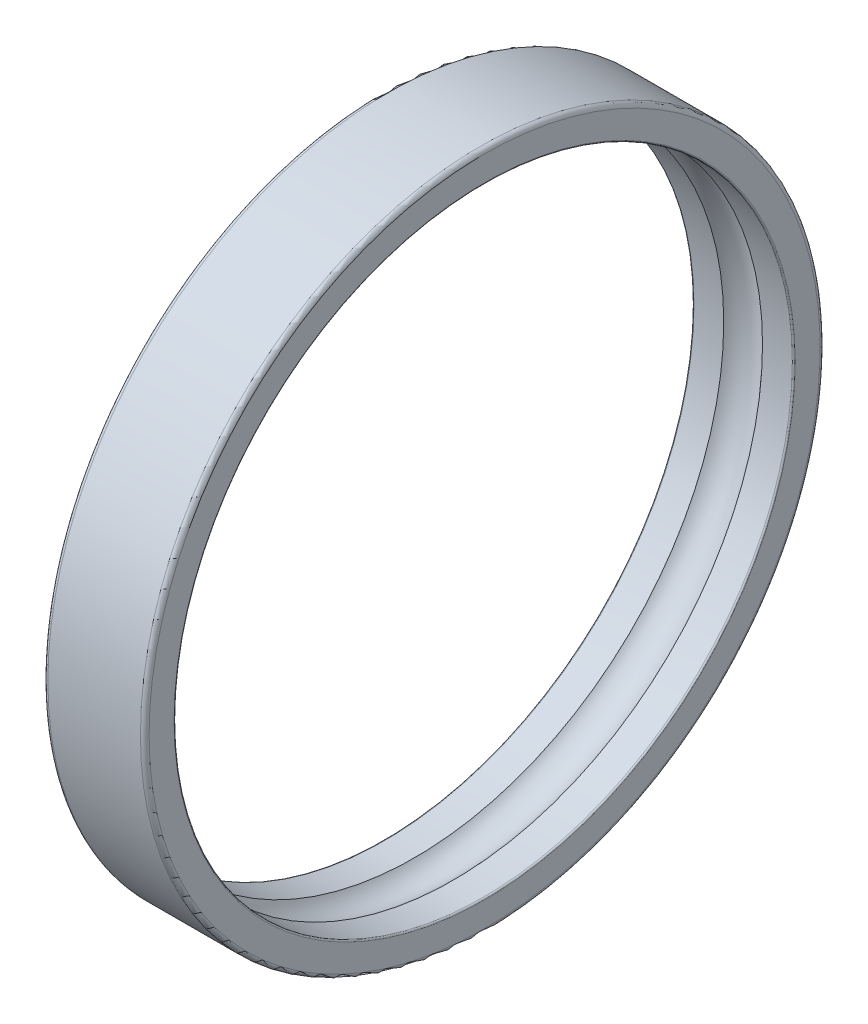
ISO-10303-21;
HEADER;
FILE_DESCRIPTION(('STEP AP214'),'2;1');
FILE_NAME('part.step','',(''),(''),'','','');
FILE_SCHEMA(('AUTOMOTIVE_DESIGN { 1 0 10303 214 1 1 1 1 }'));
ENDSEC;
DATA;
#1=APPLICATION_CONTEXT('core data for automotive mechanical design processes');
#2=APPLICATION_PROTOCOL_DEFINITION('international standard','automotive_design',2000,#1);
#3=PRODUCT_CONTEXT('',#1,'mechanical');
#4=PRODUCT('Part','Part','',(#3));
#5=PRODUCT_RELATED_PRODUCT_CATEGORY('part','',(#4));
#6=PRODUCT_DEFINITION_FORMATION('','',#4);
#7=PRODUCT_DEFINITION_CONTEXT('part definition',#1,'design');
#8=PRODUCT_DEFINITION('design','',#6,#7);
#9=PRODUCT_DEFINITION_SHAPE('','',#8);
#10=(LENGTH_UNIT() NAMED_UNIT(*) SI_UNIT(.MILLI.,.METRE.));
#11=(NAMED_UNIT(*) PLANE_ANGLE_UNIT() SI_UNIT($,.RADIAN.));
#12=(NAMED_UNIT(*) SI_UNIT($,.STERADIAN.) SOLID_ANGLE_UNIT());
#13=UNCERTAINTY_MEASURE_WITH_UNIT(LENGTH_MEASURE(1.E-05),#10,'distance_accuracy_value','');
#14=(GEOMETRIC_REPRESENTATION_CONTEXT(3) GLOBAL_UNCERTAINTY_ASSIGNED_CONTEXT((#13)) GLOBAL_UNIT_ASSIGNED_CONTEXT((#10,
#11,#12)) REPRESENTATION_CONTEXT('',''));
#15=CARTESIAN_POINT('',(0.,0.,0.));
#16=DIRECTION('',(0.,0.,1.));
#17=DIRECTION('',(1.,0.,0.));
#18=AXIS2_PLACEMENT_3D('',#15,#16,#17);
#19=CARTESIAN_POINT('',(0.,-23.6309711748326,-23.2));
#20=DIRECTION('',(-1.,0.,0.));
#21=DIRECTION('',(0.,0.,1.));
#22=AXIS2_PLACEMENT_3D('',#19,#20,#21);
#23=PLANE('',#22);
#24=CARTESIAN_POINT('',(0.,0.,0.));
#25=DIRECTION('',(-1.,0.,0.));
#26=DIRECTION('',(0.,0.,-1.));
#27=AXIS2_PLACEMENT_3D('',#24,#25,#26);
#28=CIRCLE('',#27,23.2);
#29=CARTESIAN_POINT('',(0.,0.,-23.2));
#30=VERTEX_POINT('',#29);
#31=EDGE_CURVE('E50',#30,#30,#28,.F.);
#32=ORIENTED_EDGE('',*,*,#31,.F.);
#33=EDGE_LOOP('',(#32));
#34=FACE_BOUND('',#33,.T.);
#35=CARTESIAN_POINT('',(0.,0.,0.));
#36=DIRECTION('',(1.,0.,0.));
#37=DIRECTION('',(0.,0.,1.));
#38=AXIS2_PLACEMENT_3D('',#35,#36,#37);
#39=CIRCLE('',#38,21.4749999999994);
#40=CARTESIAN_POINT('',(0.,0.,21.4749999999994));
#41=VERTEX_POINT('',#40);
#42=EDGE_CURVE('E47',#41,#41,#39,.T.);
#43=ORIENTED_EDGE('',*,*,#42,.T.);
#44=EDGE_LOOP('',(#43));
#45=FACE_BOUND('',#44,.T.);
#46=ADVANCED_FACE('F15',(#34,#45),#23,.T.);
#47=CARTESIAN_POINT('',(7.,-23.6309711748326,23.2));
#48=DIRECTION('',(1.,0.,0.));
#49=DIRECTION('',(0.,0.,-1.));
#50=AXIS2_PLACEMENT_3D('',#47,#48,#49);
#51=PLANE('',#50);
#52=CARTESIAN_POINT('',(7.,0.,0.));
#53=DIRECTION('',(1.,0.,0.));
#54=DIRECTION('',(0.,0.,1.));
#55=AXIS2_PLACEMENT_3D('',#52,#53,#54);
#56=CIRCLE('',#55,23.2);
#57=CARTESIAN_POINT('',(7.,0.,23.2));
#58=VERTEX_POINT('',#57);
#59=EDGE_CURVE('E44',#58,#58,#56,.T.);
#60=ORIENTED_EDGE('',*,*,#59,.T.);
#61=EDGE_LOOP('',(#60));
#62=FACE_BOUND('',#61,.T.);
#63=CARTESIAN_POINT('',(7.,0.,0.));
#64=DIRECTION('',(-1.,0.,0.));
#65=DIRECTION('',(0.,0.,-1.));
#66=AXIS2_PLACEMENT_3D('',#63,#64,#65);
#67=CIRCLE('',#66,21.475);
#68=CARTESIAN_POINT('',(7.,0.,-21.475));
#69=VERTEX_POINT('',#68);
#70=EDGE_CURVE('E41',#69,#69,#67,.F.);
#71=ORIENTED_EDGE('',*,*,#70,.F.);
#72=EDGE_LOOP('',(#71));
#73=FACE_BOUND('',#72,.T.);
#74=ADVANCED_FACE('F59',(#62,#73),#51,.T.);
#75=CARTESIAN_POINT('',(0.299999999999941,0.,0.));
#76=DIRECTION('',(1.,0.,0.));
#77=DIRECTION('',(0.,1.92349814194667E-10,1.));
#78=AXIS2_PLACEMENT_3D('',#75,#76,#77);
#79=TOROIDAL_SURFACE('',#78,23.2,0.299999999999939);
#80=ORIENTED_EDGE('',*,*,#31,.T.);
#81=EDGE_LOOP('',(#80));
#82=FACE_BOUND('',#81,.T.);
#83=CARTESIAN_POINT('',(0.299999999999941,0.,0.));
#84=DIRECTION('',(-1.,0.,0.));
#85=DIRECTION('',(0.,0.,-1.));
#86=AXIS2_PLACEMENT_3D('',#83,#84,#85);
#87=CIRCLE('',#86,23.4999999999999);
#88=CARTESIAN_POINT('',(0.299999999999941,0.,-23.4999999999999));
#89=VERTEX_POINT('',#88);
#90=EDGE_CURVE('E38',#89,#89,#87,.F.);
#91=ORIENTED_EDGE('',*,*,#90,.F.);
#92=EDGE_LOOP('',(#91));
#93=FACE_BOUND('',#92,.T.);
#94=ADVANCED_FACE('F54',(#82,#93),#79,.T.);
#95=CARTESIAN_POINT('',(0.0999999999994021,0.,0.));
#96=DIRECTION('',(1.,0.,0.));
#97=DIRECTION('',(0.,0.,1.));
#98=AXIS2_PLACEMENT_3D('',#95,#96,#97);
#99=TOROIDAL_SURFACE('',#98,21.4749999999994,0.0999999999994021);
#100=CARTESIAN_POINT('',(0.100000000000003,0.,0.));
#101=DIRECTION('',(1.,0.,0.));
#102=DIRECTION('',(0.,0.,1.));
#103=AXIS2_PLACEMENT_3D('',#100,#101,#102);
#104=CIRCLE('',#103,21.375);
#105=CARTESIAN_POINT('',(0.100000000000003,0.,21.375));
#106=VERTEX_POINT('',#105);
#107=EDGE_CURVE('E35',#106,#106,#104,.T.);
#108=ORIENTED_EDGE('',*,*,#107,.T.);
#109=EDGE_LOOP('',(#108));
#110=FACE_BOUND('',#109,.T.);
#111=ORIENTED_EDGE('',*,*,#42,.F.);
#112=EDGE_LOOP('',(#111));
#113=FACE_BOUND('',#112,.T.);
#114=ADVANCED_FACE('F63',(#110,#113),#99,.T.);
#115=CARTESIAN_POINT('',(50.,0.,0.));
#116=DIRECTION('',(1.,0.,0.));
#117=DIRECTION('',(0.,0.,1.));
#118=AXIS2_PLACEMENT_3D('',#115,#116,#117);
#119=CYLINDRICAL_SURFACE('',#118,21.375);
#120=CARTESIAN_POINT('',(2.1595243381545,0.,0.));
#121=DIRECTION('',(1.,0.,0.));
#122=DIRECTION('',(0.,0.,1.));
#123=AXIS2_PLACEMENT_3D('',#120,#121,#122);
#124=CIRCLE('',#123,21.375);
#125=CARTESIAN_POINT('',(2.1595243381545,0.,21.375));
#126=VERTEX_POINT('',#125);
#127=EDGE_CURVE('E30',#126,#126,#124,.T.);
#128=ORIENTED_EDGE('',*,*,#127,.T.);
#129=EDGE_LOOP('',(#128));
#130=FACE_BOUND('',#129,.T.);
#131=ORIENTED_EDGE('',*,*,#107,.F.);
#132=EDGE_LOOP('',(#131));
#133=FACE_BOUND('',#132,.T.);
#134=ADVANCED_FACE('F65',(#130,#133),#119,.F.);
#135=CARTESIAN_POINT('',(3.5,0.,0.));
#136=DIRECTION('',(1.,0.,0.));
#137=DIRECTION('',(0.,0.,1.));
#138=AXIS2_PLACEMENT_3D('',#135,#136,#137);
#139=TOROIDAL_SURFACE('',#138,20.25,1.75000000000011);
#140=ORIENTED_EDGE('',*,*,#127,.F.);
#141=EDGE_LOOP('',(#140));
#142=FACE_BOUND('',#141,.T.);
#143=CARTESIAN_POINT('',(4.84047566184556,0.,0.));
#144=DIRECTION('',(1.,0.,0.));
#145=DIRECTION('',(0.,0.,1.));
#146=AXIS2_PLACEMENT_3D('',#143,#144,#145);
#147=CIRCLE('',#146,21.375);
#148=CARTESIAN_POINT('',(4.84047566184556,0.,21.375));
#149=VERTEX_POINT('',#148);
#150=EDGE_CURVE('E26',#149,#149,#147,.T.);
#151=ORIENTED_EDGE('',*,*,#150,.T.);
#152=EDGE_LOOP('',(#151));
#153=FACE_BOUND('',#152,.T.);
#154=ADVANCED_FACE('F73',(#142,#153),#139,.F.);
#155=CARTESIAN_POINT('',(50.,0.,0.));
#156=DIRECTION('',(1.,0.,0.));
#157=DIRECTION('',(0.,0.,1.));
#158=AXIS2_PLACEMENT_3D('',#155,#156,#157);
#159=CYLINDRICAL_SURFACE('',#158,21.375);
#160=CARTESIAN_POINT('',(6.9,0.,0.));
#161=DIRECTION('',(1.,0.,0.));
#162=DIRECTION('',(0.,0.,1.));
#163=AXIS2_PLACEMENT_3D('',#160,#161,#162);
#164=CIRCLE('',#163,21.375);
#165=CARTESIAN_POINT('',(6.9,0.,21.375));
#166=VERTEX_POINT('',#165);
#167=EDGE_CURVE('E22',#166,#166,#164,.T.);
#168=ORIENTED_EDGE('',*,*,#167,.T.);
#169=EDGE_LOOP('',(#168));
#170=FACE_BOUND('',#169,.T.);
#171=ORIENTED_EDGE('',*,*,#150,.F.);
#172=EDGE_LOOP('',(#171));
#173=FACE_BOUND('',#172,.T.);
#174=ADVANCED_FACE('F81',(#170,#173),#159,.F.);
#175=CARTESIAN_POINT('',(6.90000000000067,0.,0.));
#176=DIRECTION('',(1.,0.,0.));
#177=DIRECTION('',(0.,1.16841526488096E-09,1.));
#178=AXIS2_PLACEMENT_3D('',#175,#176,#177);
#179=TOROIDAL_SURFACE('',#178,21.4749999999993,0.0999999999993263);
#180=ORIENTED_EDGE('',*,*,#70,.T.);
#181=EDGE_LOOP('',(#180));
#182=FACE_BOUND('',#181,.T.);
#183=ORIENTED_EDGE('',*,*,#167,.F.);
#184=EDGE_LOOP('',(#183));
#185=FACE_BOUND('',#184,.T.);
#186=ADVANCED_FACE('F85',(#182,#185),#179,.T.);
#187=CARTESIAN_POINT('',(6.70000000000012,0.,0.));
#188=DIRECTION('',(1.,0.,0.));
#189=DIRECTION('',(0.,0.,1.));
#190=AXIS2_PLACEMENT_3D('',#187,#188,#189);
#191=TOROIDAL_SURFACE('',#190,23.2,0.29999999999988);
#192=CARTESIAN_POINT('',(6.70000000000012,0.,0.));
#193=DIRECTION('',(1.,0.,0.));
#194=DIRECTION('',(0.,0.,1.));
#195=AXIS2_PLACEMENT_3D('',#192,#193,#194);
#196=CIRCLE('',#195,23.4999999999999);
#197=CARTESIAN_POINT('',(6.70000000000012,0.,23.4999999999999));
#198=VERTEX_POINT('',#197);
#199=EDGE_CURVE('E10',#198,#198,#196,.T.);
#200=ORIENTED_EDGE('',*,*,#199,.T.);
#201=EDGE_LOOP('',(#200));
#202=FACE_BOUND('',#201,.T.);
#203=ORIENTED_EDGE('',*,*,#59,.F.);
#204=EDGE_LOOP('',(#203));
#205=FACE_BOUND('',#204,.T.);
#206=ADVANCED_FACE('F87',(#202,#205),#191,.T.);
#207=CARTESIAN_POINT('',(50.,0.,0.));
#208=DIRECTION('',(1.,0.,0.));
#209=DIRECTION('',(0.,1.92349814194667E-10,1.));
#210=AXIS2_PLACEMENT_3D('',#207,#208,#209);
#211=CYLINDRICAL_SURFACE('',#210,23.5);
#212=ORIENTED_EDGE('',*,*,#90,.T.);
#213=EDGE_LOOP('',(#212));
#214=FACE_BOUND('',#213,.T.);
#215=ORIENTED_EDGE('',*,*,#199,.F.);
#216=EDGE_LOOP('',(#215));
#217=FACE_BOUND('',#216,.T.);
#218=ADVANCED_FACE('F17',(#214,#217),#211,.T.);
#219=CLOSED_SHELL('',(#46,#74,#94,#114,#134,#154,#174,#186,#206,#218));
#220=MANIFOLD_SOLID_BREP('B1',#219);
#221=ADVANCED_BREP_SHAPE_REPRESENTATION('',(#18,#220),#14);
#222=SHAPE_DEFINITION_REPRESENTATION(#9,#221);
ENDSEC;
END-ISO-10303-21;
